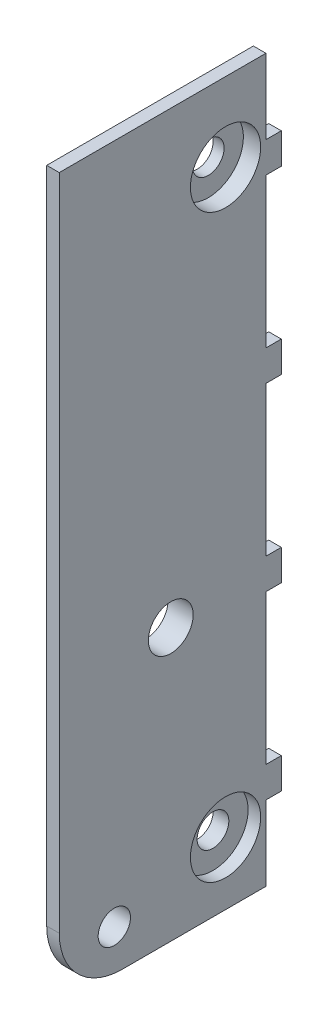
ISO-10303-21;
HEADER;
FILE_DESCRIPTION(('STEP AP214'),'2;1');
FILE_NAME('part.step','',(''),(''),'','','');
FILE_SCHEMA(('AUTOMOTIVE_DESIGN { 1 0 10303 214 1 1 1 1 }'));
ENDSEC;
DATA;
#1=APPLICATION_CONTEXT('core data for automotive mechanical design processes');
#2=APPLICATION_PROTOCOL_DEFINITION('international standard','automotive_design',2000,#1);
#3=PRODUCT_CONTEXT('',#1,'mechanical');
#4=PRODUCT('Part','Part','',(#3));
#5=PRODUCT_RELATED_PRODUCT_CATEGORY('part','',(#4));
#6=PRODUCT_DEFINITION_FORMATION('','',#4);
#7=PRODUCT_DEFINITION_CONTEXT('part definition',#1,'design');
#8=PRODUCT_DEFINITION('design','',#6,#7);
#9=PRODUCT_DEFINITION_SHAPE('','',#8);
#10=(LENGTH_UNIT() NAMED_UNIT(*) SI_UNIT(.MILLI.,.METRE.));
#11=(NAMED_UNIT(*) PLANE_ANGLE_UNIT() SI_UNIT($,.RADIAN.));
#12=(NAMED_UNIT(*) SI_UNIT($,.STERADIAN.) SOLID_ANGLE_UNIT());
#13=UNCERTAINTY_MEASURE_WITH_UNIT(LENGTH_MEASURE(1.E-05),#10,'distance_accuracy_value','');
#14=(GEOMETRIC_REPRESENTATION_CONTEXT(3) GLOBAL_UNCERTAINTY_ASSIGNED_CONTEXT((#13)) GLOBAL_UNIT_ASSIGNED_CONTEXT((#10,
#11,#12)) REPRESENTATION_CONTEXT('',''));
#15=CARTESIAN_POINT('',(0.,0.,0.));
#16=DIRECTION('',(0.,0.,1.));
#17=DIRECTION('',(1.,0.,0.));
#18=AXIS2_PLACEMENT_3D('',#15,#16,#17);
#19=CARTESIAN_POINT('',(-99.9999999999999,90.,17.));
#20=DIRECTION('',(1.,0.,0.));
#21=DIRECTION('',(0.,0.,-1.));
#22=AXIS2_PLACEMENT_3D('',#19,#20,#21);
#23=CYLINDRICAL_SURFACE('',#22,5.05);
#24=CARTESIAN_POINT('',(90.9999999999999,90.,17.));
#25=DIRECTION('',(-1.,0.,0.));
#26=DIRECTION('',(0.,0.,1.));
#27=AXIS2_PLACEMENT_3D('',#24,#25,#26);
#28=CIRCLE('',#27,5.05);
#29=CARTESIAN_POINT('',(90.9999999999999,90.,22.05));
#30=VERTEX_POINT('',#29);
#31=EDGE_CURVE('E608',#30,#30,#28,.T.);
#32=ORIENTED_EDGE('',*,*,#31,.T.);
#33=EDGE_LOOP('',(#32));
#34=FACE_BOUND('',#33,.T.);
#35=CARTESIAN_POINT('',(94.5000000000001,90.,17.));
#36=DIRECTION('',(1.,0.,0.));
#37=DIRECTION('',(0.,0.,-1.));
#38=AXIS2_PLACEMENT_3D('',#35,#36,#37);
#39=CIRCLE('',#38,5.05);
#40=CARTESIAN_POINT('',(94.5000000000001,90.,11.95));
#41=VERTEX_POINT('',#40);
#42=EDGE_CURVE('E43',#41,#41,#39,.F.);
#43=ORIENTED_EDGE('',*,*,#42,.F.);
#44=EDGE_LOOP('',(#43));
#45=FACE_BOUND('',#44,.T.);
#46=ADVANCED_FACE('F39',(#34,#45),#23,.F.);
#47=CARTESIAN_POINT('',(95.9999999999999,-111.,4.));
#48=DIRECTION('',(1.,0.,0.));
#49=DIRECTION('',(0.,0.,-1.));
#50=AXIS2_PLACEMENT_3D('',#47,#48,#49);
#51=PLANE('',#50);
#52=CARTESIAN_POINT('',(95.9999999999999,-95.,17.));
#53=DIRECTION('',(1.,0.,0.));
#54=DIRECTION('',(0.,0.,1.));
#55=AXIS2_PLACEMENT_3D('',#52,#53,#54);
#56=CIRCLE('',#55,12.5);
#57=CARTESIAN_POINT('',(95.9999999999999,-95.,29.5));
#58=VERTEX_POINT('',#57);
#59=EDGE_CURVE('E820',#58,#58,#56,.T.);
#60=ORIENTED_EDGE('',*,*,#59,.T.);
#61=EDGE_LOOP('',(#60));
#62=FACE_BOUND('',#61,.T.);
#63=CARTESIAN_POINT('',(95.9999999999999,-102.,52.45));
#64=DIRECTION('',(1.,0.,0.));
#65=DIRECTION('',(0.,0.,-1.));
#66=AXIS2_PLACEMENT_3D('',#63,#64,#65);
#67=CIRCLE('',#66,8.5);
#68=CARTESIAN_POINT('',(95.9999999999999,-102.,43.95));
#69=VERTEX_POINT('',#68);
#70=EDGE_CURVE('E49',#69,#69,#67,.F.);
#71=ORIENTED_EDGE('',*,*,#70,.F.);
#72=EDGE_LOOP('',(#71));
#73=FACE_BOUND('',#72,.T.);
#74=DIRECTION('',(0.,0.,-1.));
#75=VECTOR('',#74,1.);
#76=CARTESIAN_POINT('',(96.0000000000001,115.,70.));
#77=LINE('',#76,#75);
#78=CARTESIAN_POINT('',(96.0000000000001,115.,70.));
#79=VERTEX_POINT('',#78);
#80=CARTESIAN_POINT('',(95.9999999999999,115.,4.1191106251155));
#81=VERTEX_POINT('',#80);
#82=EDGE_CURVE('E346',#79,#81,#77,.T.);
#83=ORIENTED_EDGE('',*,*,#82,.T.);
#84=DIRECTION('',(0.,-1.,0.));
#85=VECTOR('',#84,1.);
#86=CARTESIAN_POINT('',(95.9999999999999,-111.,4.1191106251155));
#87=LINE('',#86,#85);
#88=CARTESIAN_POINT('',(95.9999999999999,91.15,4.1191106251155));
#89=VERTEX_POINT('',#88);
#90=EDGE_CURVE('E342',#81,#89,#87,.T.);
#91=ORIENTED_EDGE('',*,*,#90,.T.);
#92=DIRECTION('',(0.,0.,1.));
#93=VECTOR('',#92,1.);
#94=CARTESIAN_POINT('',(95.9999999999999,91.15,-0.780889374884504));
#95=LINE('',#94,#93);
#96=CARTESIAN_POINT('',(95.9999999999999,91.15,-0.780889374884504));
#97=VERTEX_POINT('',#96);
#98=EDGE_CURVE('E258',#97,#89,#95,.T.);
#99=ORIENTED_EDGE('',*,*,#98,.F.);
#100=DIRECTION('',(0.,-1.,0.));
#101=VECTOR('',#100,1.);
#102=CARTESIAN_POINT('',(95.9999999999999,91.15,-0.780889374884504));
#103=LINE('',#102,#101);
#104=CARTESIAN_POINT('',(95.9999999999999,81.35,-0.780889374884504));
#105=VERTEX_POINT('',#104);
#106=EDGE_CURVE('E242',#97,#105,#103,.T.);
#107=ORIENTED_EDGE('',*,*,#106,.T.);
#108=DIRECTION('',(0.,0.,1.));
#109=VECTOR('',#108,1.);
#110=CARTESIAN_POINT('',(95.9999999999999,81.35,-0.780889374884504));
#111=LINE('',#110,#109);
#112=CARTESIAN_POINT('',(95.9999999999999,81.35,4.1191106251155));
#113=VERTEX_POINT('',#112);
#114=EDGE_CURVE('E261',#105,#113,#111,.T.);
#115=ORIENTED_EDGE('',*,*,#114,.T.);
#116=CARTESIAN_POINT('',(95.9999999999999,33.65,4.1191106251155));
#117=VERTEX_POINT('',#116);
#118=EDGE_CURVE('E389',#113,#117,#87,.T.);
#119=ORIENTED_EDGE('',*,*,#118,.T.);
#120=DIRECTION('',(0.,0.,1.));
#121=VECTOR('',#120,1.);
#122=CARTESIAN_POINT('',(95.9999999999999,33.65,-0.780889374884504));
#123=LINE('',#122,#121);
#124=CARTESIAN_POINT('',(95.9999999999999,33.65,-0.780889374884504));
#125=VERTEX_POINT('',#124);
#126=EDGE_CURVE('E228',#125,#117,#123,.T.);
#127=ORIENTED_EDGE('',*,*,#126,.F.);
#128=DIRECTION('',(0.,-1.,0.));
#129=VECTOR('',#128,1.);
#130=CARTESIAN_POINT('',(95.9999999999999,23.85,-0.780889374884504));
#131=LINE('',#130,#129);
#132=CARTESIAN_POINT('',(95.9999999999999,23.85,-0.780889374884504));
#133=VERTEX_POINT('',#132);
#134=EDGE_CURVE('E211',#125,#133,#131,.T.);
#135=ORIENTED_EDGE('',*,*,#134,.T.);
#136=DIRECTION('',(0.,0.,1.));
#137=VECTOR('',#136,1.);
#138=CARTESIAN_POINT('',(95.9999999999999,23.85,-0.780889374884504));
#139=LINE('',#138,#137);
#140=CARTESIAN_POINT('',(95.9999999999999,23.85,4.1191106251155));
#141=VERTEX_POINT('',#140);
#142=EDGE_CURVE('E196',#133,#141,#139,.T.);
#143=ORIENTED_EDGE('',*,*,#142,.T.);
#144=CARTESIAN_POINT('',(95.9999999999999,-23.85,4.1191106251155));
#145=VERTEX_POINT('',#144);
#146=EDGE_CURVE('E390',#141,#145,#87,.T.);
#147=ORIENTED_EDGE('',*,*,#146,.T.);
#148=DIRECTION('',(0.,0.,1.));
#149=VECTOR('',#148,1.);
#150=CARTESIAN_POINT('',(95.9999999999999,-23.85,-0.780889374884504));
#151=LINE('',#150,#149);
#152=CARTESIAN_POINT('',(95.9999999999999,-23.85,-0.780889374884504));
#153=VERTEX_POINT('',#152);
#154=EDGE_CURVE('E290',#153,#145,#151,.T.);
#155=ORIENTED_EDGE('',*,*,#154,.F.);
#156=DIRECTION('',(0.,1.,0.));
#157=VECTOR('',#156,1.);
#158=CARTESIAN_POINT('',(95.9999999999999,-23.85,-0.780889374884504));
#159=LINE('',#158,#157);
#160=CARTESIAN_POINT('',(95.9999999999999,-33.65,-0.780889374884504));
#161=VERTEX_POINT('',#160);
#162=EDGE_CURVE('E276',#161,#153,#159,.T.);
#163=ORIENTED_EDGE('',*,*,#162,.F.);
#164=DIRECTION('',(0.,0.,1.));
#165=VECTOR('',#164,1.);
#166=CARTESIAN_POINT('',(95.9999999999999,-33.65,-0.780889374884504));
#167=LINE('',#166,#165);
#168=CARTESIAN_POINT('',(95.9999999999999,-33.65,4.1191106251155));
#169=VERTEX_POINT('',#168);
#170=EDGE_CURVE('E294',#161,#169,#167,.T.);
#171=ORIENTED_EDGE('',*,*,#170,.T.);
#172=CARTESIAN_POINT('',(95.9999999999999,-81.35,4.1191106251155));
#173=VERTEX_POINT('',#172);
#174=EDGE_CURVE('E499',#169,#173,#87,.T.);
#175=ORIENTED_EDGE('',*,*,#174,.T.);
#176=DIRECTION('',(0.,0.,1.));
#177=VECTOR('',#176,1.);
#178=CARTESIAN_POINT('',(95.9999999999999,-81.35,-0.780889374884504));
#179=LINE('',#178,#177);
#180=CARTESIAN_POINT('',(95.9999999999999,-81.35,-0.780889374884504));
#181=VERTEX_POINT('',#180);
#182=EDGE_CURVE('E325',#181,#173,#179,.T.);
#183=ORIENTED_EDGE('',*,*,#182,.F.);
#184=DIRECTION('',(0.,1.,0.));
#185=VECTOR('',#184,1.);
#186=CARTESIAN_POINT('',(95.9999999999999,-91.15,-0.780889374884504));
#187=LINE('',#186,#185);
#188=CARTESIAN_POINT('',(95.9999999999999,-91.15,-0.780889374884504));
#189=VERTEX_POINT('',#188);
#190=EDGE_CURVE('E309',#189,#181,#187,.T.);
#191=ORIENTED_EDGE('',*,*,#190,.F.);
#192=DIRECTION('',(0.,0.,1.));
#193=VECTOR('',#192,1.);
#194=CARTESIAN_POINT('',(95.9999999999999,-91.15,-0.780889374884504));
#195=LINE('',#194,#193);
#196=CARTESIAN_POINT('',(95.9999999999999,-91.15,4.1191106251155));
#197=VERTEX_POINT('',#196);
#198=EDGE_CURVE('E329',#189,#197,#195,.T.);
#199=ORIENTED_EDGE('',*,*,#198,.T.);
#200=CARTESIAN_POINT('',(96.0000000000001,-115.,4.1191106251155));
#201=VERTEX_POINT('',#200);
#202=EDGE_CURVE('E374',#197,#201,#87,.T.);
#203=ORIENTED_EDGE('',*,*,#202,.T.);
#204=DIRECTION('',(0.,0.,-1.));
#205=VECTOR('',#204,1.);
#206=CARTESIAN_POINT('',(96.0000000000001,-115.,70.));
#207=LINE('',#206,#205);
#208=CARTESIAN_POINT('',(96.0000000000001,-115.,50.));
#209=VERTEX_POINT('',#208);
#210=EDGE_CURVE('E351',#209,#201,#207,.T.);
#211=ORIENTED_EDGE('',*,*,#210,.F.);
#212=CARTESIAN_POINT('',(95.9999999999999,-95.,50.));
#213=DIRECTION('',(1.,0.,0.));
#214=DIRECTION('',(0.,0.,-1.));
#215=AXIS2_PLACEMENT_3D('',#212,#213,#214);
#216=CIRCLE('',#215,20.);
#217=CARTESIAN_POINT('',(95.9999999999999,-95.,70.));
#218=VERTEX_POINT('',#217);
#219=EDGE_CURVE('E338',#209,#218,#216,.F.);
#220=ORIENTED_EDGE('',*,*,#219,.T.);
#221=DIRECTION('',(0.,1.,0.));
#222=VECTOR('',#221,1.);
#223=CARTESIAN_POINT('',(95.9999999999999,-111.,70.));
#224=LINE('',#223,#222);
#225=EDGE_CURVE('E341',#218,#79,#224,.T.);
#226=ORIENTED_EDGE('',*,*,#225,.T.);
#227=EDGE_LOOP('',(#83,#91,#99,#107,#115,#119,#127,#135,#143,#147,#155,#163,#171,#175,#183,#191,
#199,#203,#211,#220,#226));
#228=FACE_BOUND('',#227,.T.);
#229=CARTESIAN_POINT('',(95.9999999999999,90.,17.));
#230=DIRECTION('',(1.,0.,0.));
#231=DIRECTION('',(0.,0.,-1.));
#232=AXIS2_PLACEMENT_3D('',#229,#230,#231);
#233=CIRCLE('',#232,12.5);
#234=CARTESIAN_POINT('',(95.9999999999999,90.,4.5));
#235=VERTEX_POINT('',#234);
#236=EDGE_CURVE('E405',#235,#235,#233,.F.);
#237=ORIENTED_EDGE('',*,*,#236,.F.);
#238=EDGE_LOOP('',(#237));
#239=FACE_BOUND('',#238,.T.);
#240=CARTESIAN_POINT('',(95.9999999999999,-28.4,34.45));
#241=DIRECTION('',(1.,0.,0.));
#242=DIRECTION('',(0.,0.,-1.));
#243=AXIS2_PLACEMENT_3D('',#240,#241,#242);
#244=CIRCLE('',#243,10.);
#245=CARTESIAN_POINT('',(95.9999999999999,-28.4,24.45));
#246=VERTEX_POINT('',#245);
#247=EDGE_CURVE('E11',#246,#246,#244,.F.);
#248=ORIENTED_EDGE('',*,*,#247,.F.);
#249=EDGE_LOOP('',(#248));
#250=FACE_BOUND('',#249,.T.);
#251=ADVANCED_FACE('F415',(#62,#73,#228,#239,#250),#51,.F.);
#252=CARTESIAN_POINT('',(100.,-115.,4.1191106251155));
#253=DIRECTION('',(0.,0.,1.));
#254=DIRECTION('',(1.,0.,0.));
#255=AXIS2_PLACEMENT_3D('',#252,#253,#254);
#256=PLANE('',#255);
#257=ORIENTED_EDGE('',*,*,#146,.F.);
#258=DIRECTION('',(1.,0.,0.));
#259=VECTOR('',#258,1.);
#260=CARTESIAN_POINT('',(100.,23.85,4.1191106251155));
#261=LINE('',#260,#259);
#262=CARTESIAN_POINT('',(100.,23.85,4.1191106251155));
#263=VERTEX_POINT('',#262);
#264=EDGE_CURVE('E56',#141,#263,#261,.T.);
#265=ORIENTED_EDGE('',*,*,#264,.T.);
#266=DIRECTION('',(0.,1.,0.));
#267=VECTOR('',#266,1.);
#268=CARTESIAN_POINT('',(100.,-115.,4.1191106251155));
#269=LINE('',#268,#267);
#270=CARTESIAN_POINT('',(100.,-23.85,4.1191106251155));
#271=VERTEX_POINT('',#270);
#272=EDGE_CURVE('E193',#271,#263,#269,.T.);
#273=ORIENTED_EDGE('',*,*,#272,.F.);
#274=DIRECTION('',(1.,0.,0.));
#275=VECTOR('',#274,1.);
#276=CARTESIAN_POINT('',(100.,-23.85,4.1191106251155));
#277=LINE('',#276,#275);
#278=EDGE_CURVE('E273',#145,#271,#277,.T.);
#279=ORIENTED_EDGE('',*,*,#278,.F.);
#280=EDGE_LOOP('',(#257,#265,#273,#279));
#281=FACE_BOUND('',#280,.T.);
#282=ADVANCED_FACE('F418',(#281),#256,.F.);
#283=CARTESIAN_POINT('',(100.,33.65,4.1191106251155));
#284=VERTEX_POINT('',#283);
#285=CARTESIAN_POINT('',(100.,81.35,4.1191106251155));
#286=VERTEX_POINT('',#285);
#287=EDGE_CURVE('E395',#284,#286,#269,.T.);
#288=ORIENTED_EDGE('',*,*,#287,.F.);
#289=DIRECTION('',(-1.,0.,0.));
#290=VECTOR('',#289,1.);
#291=CARTESIAN_POINT('',(100.,33.65,4.1191106251155));
#292=LINE('',#291,#290);
#293=EDGE_CURVE('E207',#284,#117,#292,.T.);
#294=ORIENTED_EDGE('',*,*,#293,.T.);
#295=ORIENTED_EDGE('',*,*,#118,.F.);
#296=DIRECTION('',(1.,0.,0.));
#297=VECTOR('',#296,1.);
#298=CARTESIAN_POINT('',(100.,81.35,4.1191106251155));
#299=LINE('',#298,#297);
#300=EDGE_CURVE('E64',#113,#286,#299,.T.);
#301=ORIENTED_EDGE('',*,*,#300,.T.);
#302=EDGE_LOOP('',(#288,#294,#295,#301));
#303=FACE_BOUND('',#302,.T.);
#304=ADVANCED_FACE('F496',(#303),#256,.F.);
#305=DIRECTION('',(-1.,0.,0.));
#306=VECTOR('',#305,1.);
#307=CARTESIAN_POINT('',(100.,-33.65,4.1191106251155));
#308=LINE('',#307,#306);
#309=CARTESIAN_POINT('',(100.,-33.65,4.1191106251155));
#310=VERTEX_POINT('',#309);
#311=EDGE_CURVE('E267',#310,#169,#308,.T.);
#312=ORIENTED_EDGE('',*,*,#311,.F.);
#313=CARTESIAN_POINT('',(100.,-81.35,4.1191106251155));
#314=VERTEX_POINT('',#313);
#315=EDGE_CURVE('E394',#314,#310,#269,.T.);
#316=ORIENTED_EDGE('',*,*,#315,.F.);
#317=DIRECTION('',(1.,0.,0.));
#318=VECTOR('',#317,1.);
#319=CARTESIAN_POINT('',(100.,-81.35,4.1191106251155));
#320=LINE('',#319,#318);
#321=EDGE_CURVE('E306',#173,#314,#320,.T.);
#322=ORIENTED_EDGE('',*,*,#321,.F.);
#323=ORIENTED_EDGE('',*,*,#174,.F.);
#324=EDGE_LOOP('',(#312,#316,#322,#323));
#325=FACE_BOUND('',#324,.T.);
#326=ADVANCED_FACE('F41',(#325),#256,.F.);
#327=CARTESIAN_POINT('',(100.,91.15,4.1191106251155));
#328=VERTEX_POINT('',#327);
#329=CARTESIAN_POINT('',(100.,115.,4.1191106251155));
#330=VERTEX_POINT('',#329);
#331=EDGE_CURVE('E364',#328,#330,#269,.T.);
#332=ORIENTED_EDGE('',*,*,#331,.F.);
#333=DIRECTION('',(-1.,0.,0.));
#334=VECTOR('',#333,1.);
#335=CARTESIAN_POINT('',(100.,91.15,4.1191106251155));
#336=LINE('',#335,#334);
#337=EDGE_CURVE('E238',#328,#89,#336,.T.);
#338=ORIENTED_EDGE('',*,*,#337,.T.);
#339=ORIENTED_EDGE('',*,*,#90,.F.);
#340=DIRECTION('',(1.,0.,0.));
#341=VECTOR('',#340,1.);
#342=CARTESIAN_POINT('',(100.,115.,4.1191106251155));
#343=LINE('',#342,#341);
#344=EDGE_CURVE('E385',#81,#330,#343,.T.);
#345=ORIENTED_EDGE('',*,*,#344,.T.);
#346=EDGE_LOOP('',(#332,#338,#339,#345));
#347=FACE_BOUND('',#346,.T.);
#348=ADVANCED_FACE('F473',(#347),#256,.F.);
#349=DIRECTION('',(-1.,0.,0.));
#350=VECTOR('',#349,1.);
#351=CARTESIAN_POINT('',(100.,-91.15,4.1191106251155));
#352=LINE('',#351,#350);
#353=CARTESIAN_POINT('',(100.,-91.15,4.1191106251155));
#354=VERTEX_POINT('',#353);
#355=EDGE_CURVE('E300',#354,#197,#352,.T.);
#356=ORIENTED_EDGE('',*,*,#355,.F.);
#357=CARTESIAN_POINT('',(100.,-115.,4.1191106251155));
#358=VERTEX_POINT('',#357);
#359=EDGE_CURVE('E352',#358,#354,#269,.T.);
#360=ORIENTED_EDGE('',*,*,#359,.F.);
#361=DIRECTION('',(1.,0.,0.));
#362=VECTOR('',#361,1.);
#363=CARTESIAN_POINT('',(100.,-115.,4.1191106251155));
#364=LINE('',#363,#362);
#365=EDGE_CURVE('E347',#201,#358,#364,.T.);
#366=ORIENTED_EDGE('',*,*,#365,.F.);
#367=ORIENTED_EDGE('',*,*,#202,.F.);
#368=EDGE_LOOP('',(#356,#360,#366,#367));
#369=FACE_BOUND('',#368,.T.);
#370=ADVANCED_FACE('F466',(#369),#256,.F.);
#371=CARTESIAN_POINT('',(-99.9999999999999,115.,70.));
#372=DIRECTION('',(0.,-1.,0.));
#373=DIRECTION('',(0.,0.,-1.));
#374=AXIS2_PLACEMENT_3D('',#371,#372,#373);
#375=PLANE('',#374);
#376=DIRECTION('',(0.,0.,-1.));
#377=VECTOR('',#376,1.);
#378=CARTESIAN_POINT('',(100.,115.,70.));
#379=LINE('',#378,#377);
#380=CARTESIAN_POINT('',(100.,115.,70.));
#381=VERTEX_POINT('',#380);
#382=EDGE_CURVE('E337',#381,#330,#379,.T.);
#383=ORIENTED_EDGE('',*,*,#382,.T.);
#384=ORIENTED_EDGE('',*,*,#344,.F.);
#385=ORIENTED_EDGE('',*,*,#82,.F.);
#386=DIRECTION('',(-1.,0.,0.));
#387=VECTOR('',#386,1.);
#388=CARTESIAN_POINT('',(-99.9999999999999,115.,70.));
#389=LINE('',#388,#387);
#390=EDGE_CURVE('E365',#381,#79,#389,.T.);
#391=ORIENTED_EDGE('',*,*,#390,.F.);
#392=EDGE_LOOP('',(#383,#384,#385,#391));
#393=FACE_BOUND('',#392,.T.);
#394=ADVANCED_FACE('F463',(#393),#375,.F.);
#395=CARTESIAN_POINT('',(0.,0.,70.));
#396=DIRECTION('',(0.,0.,-1.));
#397=DIRECTION('',(-1.,0.,0.));
#398=AXIS2_PLACEMENT_3D('',#395,#396,#397);
#399=PLANE('',#398);
#400=ORIENTED_EDGE('',*,*,#225,.F.);
#401=DIRECTION('',(1.,0.,0.));
#402=VECTOR('',#401,1.);
#403=CARTESIAN_POINT('',(0.,-95.,70.));
#404=LINE('',#403,#402);
#405=CARTESIAN_POINT('',(100.,-95.,70.));
#406=VERTEX_POINT('',#405);
#407=EDGE_CURVE('E353',#218,#406,#404,.T.);
#408=ORIENTED_EDGE('',*,*,#407,.T.);
#409=DIRECTION('',(0.,1.,0.));
#410=VECTOR('',#409,1.);
#411=CARTESIAN_POINT('',(100.,-115.,70.));
#412=LINE('',#411,#410);
#413=EDGE_CURVE('E357',#406,#381,#412,.T.);
#414=ORIENTED_EDGE('',*,*,#413,.T.);
#415=ORIENTED_EDGE('',*,*,#390,.T.);
#416=EDGE_LOOP('',(#400,#408,#414,#415));
#417=FACE_BOUND('',#416,.T.);
#418=ADVANCED_FACE('F465',(#417),#399,.F.);
#419=CARTESIAN_POINT('',(100.,-115.,70.));
#420=DIRECTION('',(-1.,0.,0.));
#421=DIRECTION('',(0.,0.,1.));
#422=AXIS2_PLACEMENT_3D('',#419,#420,#421);
#423=PLANE('',#422);
#424=CARTESIAN_POINT('',(100.,90.,17.));
#425=DIRECTION('',(-1.,0.,0.));
#426=DIRECTION('',(0.,0.,-1.));
#427=AXIS2_PLACEMENT_3D('',#424,#425,#426);
#428=CIRCLE('',#427,11.2);
#429=CARTESIAN_POINT('',(100.,90.,5.8));
#430=VERTEX_POINT('',#429);
#431=EDGE_CURVE('E573',#430,#430,#428,.T.);
#432=ORIENTED_EDGE('',*,*,#431,.T.);
#433=EDGE_LOOP('',(#432));
#434=FACE_BOUND('',#433,.T.);
#435=CARTESIAN_POINT('',(100.,-95.,17.));
#436=DIRECTION('',(1.,0.,0.));
#437=DIRECTION('',(0.,0.,-1.));
#438=AXIS2_PLACEMENT_3D('',#435,#436,#437);
#439=CIRCLE('',#438,11.2);
#440=CARTESIAN_POINT('',(100.,-95.,5.8));
#441=VERTEX_POINT('',#440);
#442=EDGE_CURVE('E577',#441,#441,#439,.T.);
#443=ORIENTED_EDGE('',*,*,#442,.F.);
#444=EDGE_LOOP('',(#443));
#445=FACE_BOUND('',#444,.T.);
#446=CARTESIAN_POINT('',(100.,-102.,52.45));
#447=DIRECTION('',(1.,0.,0.));
#448=DIRECTION('',(0.,0.,-1.));
#449=AXIS2_PLACEMENT_3D('',#446,#447,#448);
#450=CIRCLE('',#449,5.15);
#451=CARTESIAN_POINT('',(100.,-102.,47.3));
#452=VERTEX_POINT('',#451);
#453=EDGE_CURVE('E381',#452,#452,#450,.T.);
#454=ORIENTED_EDGE('',*,*,#453,.F.);
#455=EDGE_LOOP('',(#454));
#456=FACE_BOUND('',#455,.T.);
#457=CARTESIAN_POINT('',(100.,-28.4,34.45));
#458=DIRECTION('',(1.,0.,0.));
#459=DIRECTION('',(0.,0.,-1.));
#460=AXIS2_PLACEMENT_3D('',#457,#458,#459);
#461=CIRCLE('',#460,7.15);
#462=CARTESIAN_POINT('',(100.,-28.4,27.3));
#463=VERTEX_POINT('',#462);
#464=EDGE_CURVE('E370',#463,#463,#461,.T.);
#465=ORIENTED_EDGE('',*,*,#464,.F.);
#466=EDGE_LOOP('',(#465));
#467=FACE_BOUND('',#466,.T.);
#468=DIRECTION('',(0.,0.,-1.));
#469=VECTOR('',#468,1.);
#470=CARTESIAN_POINT('',(100.,-115.,70.));
#471=LINE('',#470,#469);
#472=CARTESIAN_POINT('',(100.,-115.,50.));
#473=VERTEX_POINT('',#472);
#474=EDGE_CURVE('E361',#473,#358,#471,.T.);
#475=ORIENTED_EDGE('',*,*,#474,.T.);
#476=ORIENTED_EDGE('',*,*,#359,.T.);
#477=DIRECTION('',(0.,0.,1.));
#478=VECTOR('',#477,1.);
#479=CARTESIAN_POINT('',(100.,-91.15,-0.780889374884504));
#480=LINE('',#479,#478);
#481=CARTESIAN_POINT('',(100.,-91.15,-0.780889374884504));
#482=VERTEX_POINT('',#481);
#483=EDGE_CURVE('E333',#482,#354,#480,.T.);
#484=ORIENTED_EDGE('',*,*,#483,.F.);
#485=DIRECTION('',(0.,-1.,0.));
#486=VECTOR('',#485,1.);
#487=CARTESIAN_POINT('',(100.,-91.15,-0.780889374884504));
#488=LINE('',#487,#486);
#489=CARTESIAN_POINT('',(100.,-81.35,-0.780889374884504));
#490=VERTEX_POINT('',#489);
#491=EDGE_CURVE('E301',#490,#482,#488,.T.);
#492=ORIENTED_EDGE('',*,*,#491,.F.);
#493=DIRECTION('',(0.,0.,1.));
#494=VECTOR('',#493,1.);
#495=CARTESIAN_POINT('',(100.,-81.35,-0.780889374884504));
#496=LINE('',#495,#494);
#497=EDGE_CURVE('E315',#490,#314,#496,.T.);
#498=ORIENTED_EDGE('',*,*,#497,.T.);
#499=ORIENTED_EDGE('',*,*,#315,.T.);
#500=DIRECTION('',(0.,0.,1.));
#501=VECTOR('',#500,1.);
#502=CARTESIAN_POINT('',(100.,-33.65,-0.780889374884504));
#503=LINE('',#502,#501);
#504=CARTESIAN_POINT('',(100.,-33.65,-0.780889374884504));
#505=VERTEX_POINT('',#504);
#506=EDGE_CURVE('E297',#505,#310,#503,.T.);
#507=ORIENTED_EDGE('',*,*,#506,.F.);
#508=DIRECTION('',(0.,-1.,0.));
#509=VECTOR('',#508,1.);
#510=CARTESIAN_POINT('',(100.,-23.85,-0.780889374884504));
#511=LINE('',#510,#509);
#512=CARTESIAN_POINT('',(100.,-23.85,-0.780889374884504));
#513=VERTEX_POINT('',#512);
#514=EDGE_CURVE('E268',#513,#505,#511,.T.);
#515=ORIENTED_EDGE('',*,*,#514,.F.);
#516=DIRECTION('',(0.,0.,1.));
#517=VECTOR('',#516,1.);
#518=CARTESIAN_POINT('',(100.,-23.85,-0.780889374884504));
#519=LINE('',#518,#517);
#520=EDGE_CURVE('E282',#513,#271,#519,.T.);
#521=ORIENTED_EDGE('',*,*,#520,.T.);
#522=ORIENTED_EDGE('',*,*,#272,.T.);
#523=DIRECTION('',(0.,0.,1.));
#524=VECTOR('',#523,1.);
#525=CARTESIAN_POINT('',(100.,23.85,-0.780889374884504));
#526=LINE('',#525,#524);
#527=CARTESIAN_POINT('',(100.,23.85,-0.780889374884504));
#528=VERTEX_POINT('',#527);
#529=EDGE_CURVE('E185',#528,#263,#526,.T.);
#530=ORIENTED_EDGE('',*,*,#529,.F.);
#531=DIRECTION('',(0.,1.,0.));
#532=VECTOR('',#531,1.);
#533=CARTESIAN_POINT('',(100.,23.85,-0.780889374884504));
#534=LINE('',#533,#532);
#535=CARTESIAN_POINT('',(100.,33.65,-0.780889374884504));
#536=VERTEX_POINT('',#535);
#537=EDGE_CURVE('E189',#528,#536,#534,.T.);
#538=ORIENTED_EDGE('',*,*,#537,.T.);
#539=DIRECTION('',(0.,0.,1.));
#540=VECTOR('',#539,1.);
#541=CARTESIAN_POINT('',(100.,33.65,-0.780889374884504));
#542=LINE('',#541,#540);
#543=EDGE_CURVE('E219',#536,#284,#542,.T.);
#544=ORIENTED_EDGE('',*,*,#543,.T.);
#545=ORIENTED_EDGE('',*,*,#287,.T.);
#546=DIRECTION('',(0.,0.,1.));
#547=VECTOR('',#546,1.);
#548=CARTESIAN_POINT('',(100.,81.35,-0.780889374884504));
#549=LINE('',#548,#547);
#550=CARTESIAN_POINT('',(100.,81.35,-0.780889374884504));
#551=VERTEX_POINT('',#550);
#552=EDGE_CURVE('E264',#551,#286,#549,.T.);
#553=ORIENTED_EDGE('',*,*,#552,.F.);
#554=DIRECTION('',(0.,1.,0.));
#555=VECTOR('',#554,1.);
#556=CARTESIAN_POINT('',(100.,91.15,-0.780889374884504));
#557=LINE('',#556,#555);
#558=CARTESIAN_POINT('',(100.,91.15,-0.780889374884504));
#559=VERTEX_POINT('',#558);
#560=EDGE_CURVE('E233',#551,#559,#557,.T.);
#561=ORIENTED_EDGE('',*,*,#560,.T.);
#562=DIRECTION('',(0.,0.,1.));
#563=VECTOR('',#562,1.);
#564=CARTESIAN_POINT('',(100.,91.15,-0.780889374884504));
#565=LINE('',#564,#563);
#566=EDGE_CURVE('E250',#559,#328,#565,.T.);
#567=ORIENTED_EDGE('',*,*,#566,.T.);
#568=ORIENTED_EDGE('',*,*,#331,.T.);
#569=ORIENTED_EDGE('',*,*,#382,.F.);
#570=ORIENTED_EDGE('',*,*,#413,.F.);
#571=CARTESIAN_POINT('',(100.,-95.,50.));
#572=DIRECTION('',(-1.,0.,0.));
#573=DIRECTION('',(0.,0.,1.));
#574=AXIS2_PLACEMENT_3D('',#571,#572,#573);
#575=CIRCLE('',#574,20.);
#576=EDGE_CURVE('E348',#406,#473,#575,.F.);
#577=ORIENTED_EDGE('',*,*,#576,.T.);
#578=EDGE_LOOP('',(#475,#476,#484,#492,#498,#499,#507,#515,#521,#522,#530,#538,#544,#545,#553,
#561,#567,#568,#569,#570,#577));
#579=FACE_BOUND('',#578,.T.);
#580=ADVANCED_FACE('F188',(#434,#445,#456,#467,#579),#423,.F.);
#581=CARTESIAN_POINT('',(-99.9999999999999,-115.,70.));
#582=DIRECTION('',(0.,1.,0.));
#583=DIRECTION('',(0.,0.,1.));
#584=AXIS2_PLACEMENT_3D('',#581,#582,#583);
#585=PLANE('',#584);
#586=ORIENTED_EDGE('',*,*,#210,.T.);
#587=ORIENTED_EDGE('',*,*,#365,.T.);
#588=ORIENTED_EDGE('',*,*,#474,.F.);
#589=DIRECTION('',(1.,0.,0.));
#590=VECTOR('',#589,1.);
#591=CARTESIAN_POINT('',(-99.9999999999999,-115.,50.));
#592=LINE('',#591,#590);
#593=EDGE_CURVE('E343',#473,#209,#592,.F.);
#594=ORIENTED_EDGE('',*,*,#593,.T.);
#595=EDGE_LOOP('',(#586,#587,#588,#594));
#596=FACE_BOUND('',#595,.T.);
#597=ADVANCED_FACE('F460',(#596),#585,.F.);
#598=CARTESIAN_POINT('',(-99.9999999999999,-28.4,34.45));
#599=DIRECTION('',(1.,0.,0.));
#600=DIRECTION('',(0.,0.,-1.));
#601=AXIS2_PLACEMENT_3D('',#598,#599,#600);
#602=CYLINDRICAL_SURFACE('',#601,7.15);
#603=ORIENTED_EDGE('',*,*,#464,.T.);
#604=EDGE_LOOP('',(#603));
#605=FACE_BOUND('',#604,.T.);
#606=CARTESIAN_POINT('',(91.9999999999999,-28.4,34.45));
#607=DIRECTION('',(-1.,0.,0.));
#608=DIRECTION('',(0.,0.,1.));
#609=AXIS2_PLACEMENT_3D('',#606,#607,#608);
#610=CIRCLE('',#609,7.15000000000001);
#611=CARTESIAN_POINT('',(91.9999999999999,-28.4,41.6));
#612=VERTEX_POINT('',#611);
#613=EDGE_CURVE('E586',#612,#612,#610,.T.);
#614=ORIENTED_EDGE('',*,*,#613,.T.);
#615=EDGE_LOOP('',(#614));
#616=FACE_BOUND('',#615,.T.);
#617=ADVANCED_FACE('F453',(#605,#616),#602,.F.);
#618=CARTESIAN_POINT('',(-99.9999999999999,-102.,52.45));
#619=DIRECTION('',(1.,0.,0.));
#620=DIRECTION('',(0.,0.,-1.));
#621=AXIS2_PLACEMENT_3D('',#618,#619,#620);
#622=CYLINDRICAL_SURFACE('',#621,5.15);
#623=ORIENTED_EDGE('',*,*,#453,.T.);
#624=EDGE_LOOP('',(#623));
#625=FACE_BOUND('',#624,.T.);
#626=CARTESIAN_POINT('',(90.9999999999999,-102.,52.45));
#627=DIRECTION('',(-1.,0.,0.));
#628=DIRECTION('',(0.,0.,1.));
#629=AXIS2_PLACEMENT_3D('',#626,#627,#628);
#630=CIRCLE('',#629,5.15);
#631=CARTESIAN_POINT('',(90.9999999999999,-102.,57.6));
#632=VERTEX_POINT('',#631);
#633=EDGE_CURVE('E595',#632,#632,#630,.T.);
#634=ORIENTED_EDGE('',*,*,#633,.T.);
#635=EDGE_LOOP('',(#634));
#636=FACE_BOUND('',#635,.T.);
#637=ADVANCED_FACE('F455',(#625,#636),#622,.F.);
#638=CARTESIAN_POINT('',(0.,-95.,50.));
#639=DIRECTION('',(1.,0.,0.));
#640=DIRECTION('',(0.,0.,-1.));
#641=AXIS2_PLACEMENT_3D('',#638,#639,#640);
#642=CYLINDRICAL_SURFACE('',#641,20.);
#643=ORIENTED_EDGE('',*,*,#219,.F.);
#644=ORIENTED_EDGE('',*,*,#593,.F.);
#645=ORIENTED_EDGE('',*,*,#576,.F.);
#646=ORIENTED_EDGE('',*,*,#407,.F.);
#647=EDGE_LOOP('',(#643,#644,#645,#646));
#648=FACE_BOUND('',#647,.T.);
#649=ADVANCED_FACE('F458',(#648),#642,.T.);
#650=CARTESIAN_POINT('',(100.,-91.15,-0.780889374884504));
#651=DIRECTION('',(0.,1.,0.));
#652=DIRECTION('',(0.,0.,1.));
#653=AXIS2_PLACEMENT_3D('',#650,#651,#652);
#654=PLANE('',#653);
#655=ORIENTED_EDGE('',*,*,#355,.T.);
#656=ORIENTED_EDGE('',*,*,#198,.F.);
#657=DIRECTION('',(-1.,0.,0.));
#658=VECTOR('',#657,1.);
#659=CARTESIAN_POINT('',(100.,-91.15,-0.780889374884504));
#660=LINE('',#659,#658);
#661=EDGE_CURVE('E305',#482,#189,#660,.T.);
#662=ORIENTED_EDGE('',*,*,#661,.F.);
#663=ORIENTED_EDGE('',*,*,#483,.T.);
#664=EDGE_LOOP('',(#655,#656,#662,#663));
#665=FACE_BOUND('',#664,.T.);
#666=ADVANCED_FACE('F519',(#665),#654,.F.);
#667=CARTESIAN_POINT('',(100.,-81.35,-0.780889374884504));
#668=DIRECTION('',(0.,-1.,0.));
#669=DIRECTION('',(0.,0.,-1.));
#670=AXIS2_PLACEMENT_3D('',#667,#668,#669);
#671=PLANE('',#670);
#672=ORIENTED_EDGE('',*,*,#321,.T.);
#673=ORIENTED_EDGE('',*,*,#497,.F.);
#674=DIRECTION('',(1.,0.,0.));
#675=VECTOR('',#674,1.);
#676=CARTESIAN_POINT('',(100.,-81.35,-0.780889374884504));
#677=LINE('',#676,#675);
#678=EDGE_CURVE('E312',#181,#490,#677,.T.);
#679=ORIENTED_EDGE('',*,*,#678,.F.);
#680=ORIENTED_EDGE('',*,*,#182,.T.);
#681=EDGE_LOOP('',(#672,#673,#679,#680));
#682=FACE_BOUND('',#681,.T.);
#683=ADVANCED_FACE('F527',(#682),#671,.F.);
#684=CARTESIAN_POINT('',(0.,0.,-0.780889374884504));
#685=DIRECTION('',(0.,0.,1.));
#686=DIRECTION('',(1.,0.,0.));
#687=AXIS2_PLACEMENT_3D('',#684,#685,#686);
#688=PLANE('',#687);
#689=ORIENTED_EDGE('',*,*,#491,.T.);
#690=ORIENTED_EDGE('',*,*,#661,.T.);
#691=ORIENTED_EDGE('',*,*,#190,.T.);
#692=ORIENTED_EDGE('',*,*,#678,.T.);
#693=EDGE_LOOP('',(#689,#690,#691,#692));
#694=FACE_BOUND('',#693,.T.);
#695=ADVANCED_FACE('F521',(#694),#688,.F.);
#696=CARTESIAN_POINT('',(100.,-33.65,-0.780889374884504));
#697=DIRECTION('',(0.,1.,0.));
#698=DIRECTION('',(-1.,0.,0.));
#699=AXIS2_PLACEMENT_3D('',#696,#697,#698);
#700=PLANE('',#699);
#701=ORIENTED_EDGE('',*,*,#311,.T.);
#702=ORIENTED_EDGE('',*,*,#170,.F.);
#703=DIRECTION('',(-1.,0.,0.));
#704=VECTOR('',#703,1.);
#705=CARTESIAN_POINT('',(100.,-33.65,-0.780889374884504));
#706=LINE('',#705,#704);
#707=EDGE_CURVE('E272',#505,#161,#706,.T.);
#708=ORIENTED_EDGE('',*,*,#707,.F.);
#709=ORIENTED_EDGE('',*,*,#506,.T.);
#710=EDGE_LOOP('',(#701,#702,#708,#709));
#711=FACE_BOUND('',#710,.T.);
#712=ADVANCED_FACE('F549',(#711),#700,.F.);
#713=CARTESIAN_POINT('',(100.,-23.85,-0.780889374884504));
#714=DIRECTION('',(0.,-1.,0.));
#715=DIRECTION('',(1.,0.,0.));
#716=AXIS2_PLACEMENT_3D('',#713,#714,#715);
#717=PLANE('',#716);
#718=ORIENTED_EDGE('',*,*,#278,.T.);
#719=ORIENTED_EDGE('',*,*,#520,.F.);
#720=DIRECTION('',(1.,0.,0.));
#721=VECTOR('',#720,1.);
#722=CARTESIAN_POINT('',(100.,-23.85,-0.780889374884504));
#723=LINE('',#722,#721);
#724=EDGE_CURVE('E279',#153,#513,#723,.T.);
#725=ORIENTED_EDGE('',*,*,#724,.F.);
#726=ORIENTED_EDGE('',*,*,#154,.T.);
#727=EDGE_LOOP('',(#718,#719,#725,#726));
#728=FACE_BOUND('',#727,.T.);
#729=ADVANCED_FACE('F541',(#728),#717,.F.);
#730=CARTESIAN_POINT('',(0.,0.,-0.780889374884504));
#731=DIRECTION('',(0.,0.,-1.));
#732=DIRECTION('',(-1.,0.,0.));
#733=AXIS2_PLACEMENT_3D('',#730,#731,#732);
#734=PLANE('',#733);
#735=ORIENTED_EDGE('',*,*,#514,.T.);
#736=ORIENTED_EDGE('',*,*,#707,.T.);
#737=ORIENTED_EDGE('',*,*,#162,.T.);
#738=ORIENTED_EDGE('',*,*,#724,.T.);
#739=EDGE_LOOP('',(#735,#736,#737,#738));
#740=FACE_BOUND('',#739,.T.);
#741=ADVANCED_FACE('F545',(#740),#734,.T.);
#742=CARTESIAN_POINT('',(100.,81.35,-0.780889374884504));
#743=DIRECTION('',(0.,-1.,0.));
#744=DIRECTION('',(0.,0.,-1.));
#745=AXIS2_PLACEMENT_3D('',#742,#743,#744);
#746=PLANE('',#745);
#747=ORIENTED_EDGE('',*,*,#300,.F.);
#748=ORIENTED_EDGE('',*,*,#114,.F.);
#749=DIRECTION('',(1.,0.,0.));
#750=VECTOR('',#749,1.);
#751=CARTESIAN_POINT('',(100.,81.35,-0.780889374884504));
#752=LINE('',#751,#750);
#753=EDGE_CURVE('E237',#105,#551,#752,.T.);
#754=ORIENTED_EDGE('',*,*,#753,.T.);
#755=ORIENTED_EDGE('',*,*,#552,.T.);
#756=EDGE_LOOP('',(#747,#748,#754,#755));
#757=FACE_BOUND('',#756,.T.);
#758=ADVANCED_FACE('F491',(#757),#746,.T.);
#759=CARTESIAN_POINT('',(100.,91.15,-0.780889374884504));
#760=DIRECTION('',(0.,1.,0.));
#761=DIRECTION('',(0.,0.,1.));
#762=AXIS2_PLACEMENT_3D('',#759,#760,#761);
#763=PLANE('',#762);
#764=ORIENTED_EDGE('',*,*,#337,.F.);
#765=ORIENTED_EDGE('',*,*,#566,.F.);
#766=DIRECTION('',(-1.,0.,0.));
#767=VECTOR('',#766,1.);
#768=CARTESIAN_POINT('',(100.,91.15,-0.780889374884504));
#769=LINE('',#768,#767);
#770=EDGE_CURVE('E246',#559,#97,#769,.T.);
#771=ORIENTED_EDGE('',*,*,#770,.T.);
#772=ORIENTED_EDGE('',*,*,#98,.T.);
#773=EDGE_LOOP('',(#764,#765,#771,#772));
#774=FACE_BOUND('',#773,.T.);
#775=ADVANCED_FACE('F490',(#774),#763,.T.);
#776=CARTESIAN_POINT('',(0.,0.,-0.780889374884504));
#777=DIRECTION('',(0.,0.,1.));
#778=DIRECTION('',(1.,0.,0.));
#779=AXIS2_PLACEMENT_3D('',#776,#777,#778);
#780=PLANE('',#779);
#781=ORIENTED_EDGE('',*,*,#560,.F.);
#782=ORIENTED_EDGE('',*,*,#753,.F.);
#783=ORIENTED_EDGE('',*,*,#106,.F.);
#784=ORIENTED_EDGE('',*,*,#770,.F.);
#785=EDGE_LOOP('',(#781,#782,#783,#784));
#786=FACE_BOUND('',#785,.T.);
#787=ADVANCED_FACE('F489',(#786),#780,.F.);
#788=CARTESIAN_POINT('',(100.,23.85,-0.780889374884504));
#789=DIRECTION('',(0.,-1.,0.));
#790=DIRECTION('',(1.,0.,0.));
#791=AXIS2_PLACEMENT_3D('',#788,#789,#790);
#792=PLANE('',#791);
#793=ORIENTED_EDGE('',*,*,#264,.F.);
#794=ORIENTED_EDGE('',*,*,#142,.F.);
#795=DIRECTION('',(1.,0.,0.));
#796=VECTOR('',#795,1.);
#797=CARTESIAN_POINT('',(100.,23.85,-0.780889374884504));
#798=LINE('',#797,#796);
#799=EDGE_CURVE('E202',#133,#528,#798,.T.);
#800=ORIENTED_EDGE('',*,*,#799,.T.);
#801=ORIENTED_EDGE('',*,*,#529,.T.);
#802=EDGE_LOOP('',(#793,#794,#800,#801));
#803=FACE_BOUND('',#802,.T.);
#804=ADVANCED_FACE('F209',(#803),#792,.T.);
#805=CARTESIAN_POINT('',(100.,33.65,-0.780889374884504));
#806=DIRECTION('',(0.,1.,0.));
#807=DIRECTION('',(-1.,0.,0.));
#808=AXIS2_PLACEMENT_3D('',#805,#806,#807);
#809=PLANE('',#808);
#810=ORIENTED_EDGE('',*,*,#293,.F.);
#811=ORIENTED_EDGE('',*,*,#543,.F.);
#812=DIRECTION('',(-1.,0.,0.));
#813=VECTOR('',#812,1.);
#814=CARTESIAN_POINT('',(100.,33.65,-0.780889374884504));
#815=LINE('',#814,#813);
#816=EDGE_CURVE('E205',#536,#125,#815,.T.);
#817=ORIENTED_EDGE('',*,*,#816,.T.);
#818=ORIENTED_EDGE('',*,*,#126,.T.);
#819=EDGE_LOOP('',(#810,#811,#817,#818));
#820=FACE_BOUND('',#819,.T.);
#821=ADVANCED_FACE('F534',(#820),#809,.T.);
#822=CARTESIAN_POINT('',(0.,0.,-0.780889374884504));
#823=DIRECTION('',(0.,0.,-1.));
#824=DIRECTION('',(-1.,0.,0.));
#825=AXIS2_PLACEMENT_3D('',#822,#823,#824);
#826=PLANE('',#825);
#827=ORIENTED_EDGE('',*,*,#537,.F.);
#828=ORIENTED_EDGE('',*,*,#799,.F.);
#829=ORIENTED_EDGE('',*,*,#134,.F.);
#830=ORIENTED_EDGE('',*,*,#816,.F.);
#831=EDGE_LOOP('',(#827,#828,#829,#830));
#832=FACE_BOUND('',#831,.T.);
#833=ADVANCED_FACE('F200',(#832),#826,.T.);
#834=CARTESIAN_POINT('',(90.9999999999999,90.,17.));
#835=DIRECTION('',(-1.,0.,0.));
#836=DIRECTION('',(0.,0.,1.));
#837=AXIS2_PLACEMENT_3D('',#834,#835,#836);
#838=PLANE('',#837);
#839=CARTESIAN_POINT('',(90.9999999999999,90.,17.));
#840=DIRECTION('',(-1.,0.,0.));
#841=DIRECTION('',(0.,0.,1.));
#842=AXIS2_PLACEMENT_3D('',#839,#840,#841);
#843=CIRCLE('',#842,12.5);
#844=CARTESIAN_POINT('',(90.9999999999999,90.,29.5));
#845=VERTEX_POINT('',#844);
#846=EDGE_CURVE('E222',#845,#845,#843,.T.);
#847=ORIENTED_EDGE('',*,*,#846,.T.);
#848=EDGE_LOOP('',(#847));
#849=FACE_BOUND('',#848,.T.);
#850=ORIENTED_EDGE('',*,*,#31,.F.);
#851=EDGE_LOOP('',(#850));
#852=FACE_BOUND('',#851,.T.);
#853=ADVANCED_FACE('F614',(#849,#852),#838,.T.);
#854=CARTESIAN_POINT('',(90.9999999999999,90.,17.));
#855=DIRECTION('',(1.,0.,0.));
#856=DIRECTION('',(0.,0.,-1.));
#857=AXIS2_PLACEMENT_3D('',#854,#855,#856);
#858=CYLINDRICAL_SURFACE('',#857,12.5);
#859=ORIENTED_EDGE('',*,*,#846,.F.);
#860=EDGE_LOOP('',(#859));
#861=FACE_BOUND('',#860,.T.);
#862=ORIENTED_EDGE('',*,*,#236,.T.);
#863=EDGE_LOOP('',(#862));
#864=FACE_BOUND('',#863,.T.);
#865=ADVANCED_FACE('F617',(#861,#864),#858,.T.);
#866=CARTESIAN_POINT('',(90.9999999999999,-102.,52.45));
#867=DIRECTION('',(-1.,0.,0.));
#868=DIRECTION('',(0.,0.,1.));
#869=AXIS2_PLACEMENT_3D('',#866,#867,#868);
#870=PLANE('',#869);
#871=CARTESIAN_POINT('',(90.9999999999999,-102.,52.45));
#872=DIRECTION('',(-1.,0.,0.));
#873=DIRECTION('',(0.,0.,1.));
#874=AXIS2_PLACEMENT_3D('',#871,#872,#873);
#875=CIRCLE('',#874,8.5);
#876=CARTESIAN_POINT('',(90.9999999999999,-102.,60.95));
#877=VERTEX_POINT('',#876);
#878=EDGE_CURVE('E604',#877,#877,#875,.T.);
#879=ORIENTED_EDGE('',*,*,#878,.T.);
#880=EDGE_LOOP('',(#879));
#881=FACE_BOUND('',#880,.T.);
#882=ORIENTED_EDGE('',*,*,#633,.F.);
#883=EDGE_LOOP('',(#882));
#884=FACE_BOUND('',#883,.T.);
#885=ADVANCED_FACE('F620',(#881,#884),#870,.T.);
#886=CARTESIAN_POINT('',(90.9999999999999,-102.,52.45));
#887=DIRECTION('',(1.,0.,0.));
#888=DIRECTION('',(0.,0.,-1.));
#889=AXIS2_PLACEMENT_3D('',#886,#887,#888);
#890=CYLINDRICAL_SURFACE('',#889,8.5);
#891=ORIENTED_EDGE('',*,*,#878,.F.);
#892=EDGE_LOOP('',(#891));
#893=FACE_BOUND('',#892,.T.);
#894=ORIENTED_EDGE('',*,*,#70,.T.);
#895=EDGE_LOOP('',(#894));
#896=FACE_BOUND('',#895,.T.);
#897=ADVANCED_FACE('F413',(#893,#896),#890,.T.);
#898=CARTESIAN_POINT('',(91.9999999999999,-28.4,34.45));
#899=DIRECTION('',(-1.,0.,0.));
#900=DIRECTION('',(0.,0.,1.));
#901=AXIS2_PLACEMENT_3D('',#898,#899,#900);
#902=PLANE('',#901);
#903=CARTESIAN_POINT('',(91.9999999999999,-28.4,34.45));
#904=DIRECTION('',(-1.,0.,0.));
#905=DIRECTION('',(0.,0.,1.));
#906=AXIS2_PLACEMENT_3D('',#903,#904,#905);
#907=CIRCLE('',#906,10.);
#908=CARTESIAN_POINT('',(91.9999999999999,-28.4,44.45));
#909=VERTEX_POINT('',#908);
#910=EDGE_CURVE('E589',#909,#909,#907,.T.);
#911=ORIENTED_EDGE('',*,*,#910,.T.);
#912=EDGE_LOOP('',(#911));
#913=FACE_BOUND('',#912,.T.);
#914=ORIENTED_EDGE('',*,*,#613,.F.);
#915=EDGE_LOOP('',(#914));
#916=FACE_BOUND('',#915,.T.);
#917=ADVANCED_FACE('F430',(#913,#916),#902,.T.);
#918=CARTESIAN_POINT('',(91.9999999999999,-28.4,34.45));
#919=DIRECTION('',(1.,0.,0.));
#920=DIRECTION('',(0.,0.,-1.));
#921=AXIS2_PLACEMENT_3D('',#918,#919,#920);
#922=CYLINDRICAL_SURFACE('',#921,10.);
#923=ORIENTED_EDGE('',*,*,#910,.F.);
#924=EDGE_LOOP('',(#923));
#925=FACE_BOUND('',#924,.T.);
#926=ORIENTED_EDGE('',*,*,#247,.T.);
#927=EDGE_LOOP('',(#926));
#928=FACE_BOUND('',#927,.T.);
#929=ADVANCED_FACE('F427',(#925,#928),#922,.T.);
#930=CARTESIAN_POINT('',(94.5000000000001,-95.,17.));
#931=DIRECTION('',(1.,0.,0.));
#932=DIRECTION('',(0.,0.,-1.));
#933=AXIS2_PLACEMENT_3D('',#930,#931,#932);
#934=CYLINDRICAL_SURFACE('',#933,11.2);
#935=ORIENTED_EDGE('',*,*,#442,.T.);
#936=EDGE_LOOP('',(#935));
#937=FACE_BOUND('',#936,.T.);
#938=CARTESIAN_POINT('',(95.9999999999999,-95.,17.));
#939=DIRECTION('',(1.,0.,0.));
#940=DIRECTION('',(0.,0.,-1.));
#941=AXIS2_PLACEMENT_3D('',#938,#939,#940);
#942=CIRCLE('',#941,11.2);
#943=CARTESIAN_POINT('',(95.9999999999999,-95.,5.8));
#944=VERTEX_POINT('',#943);
#945=EDGE_CURVE('E590',#944,#944,#942,.T.);
#946=ORIENTED_EDGE('',*,*,#945,.F.);
#947=EDGE_LOOP('',(#946));
#948=FACE_BOUND('',#947,.T.);
#949=ADVANCED_FACE('F429',(#937,#948),#934,.F.);
#950=CARTESIAN_POINT('',(95.9999999999999,-95.,17.));
#951=DIRECTION('',(-1.,0.,0.));
#952=DIRECTION('',(0.,0.,1.));
#953=AXIS2_PLACEMENT_3D('',#950,#951,#952);
#954=PLANE('',#953);
#955=CARTESIAN_POINT('',(95.9999999999999,-95.,17.));
#956=DIRECTION('',(1.,0.,0.));
#957=DIRECTION('',(0.,0.,1.));
#958=AXIS2_PLACEMENT_3D('',#955,#956,#957);
#959=CIRCLE('',#958,5.05);
#960=CARTESIAN_POINT('',(95.9999999999999,-95.,22.05));
#961=VERTEX_POINT('',#960);
#962=EDGE_CURVE('E821',#961,#961,#959,.T.);
#963=ORIENTED_EDGE('',*,*,#962,.F.);
#964=EDGE_LOOP('',(#963));
#965=FACE_BOUND('',#964,.T.);
#966=ORIENTED_EDGE('',*,*,#945,.T.);
#967=EDGE_LOOP('',(#966));
#968=FACE_BOUND('',#967,.T.);
#969=ADVANCED_FACE('F437',(#965,#968),#954,.F.);
#970=CARTESIAN_POINT('',(90.9999999999999,-95.,17.));
#971=DIRECTION('',(1.,0.,0.));
#972=DIRECTION('',(0.,0.,-1.));
#973=AXIS2_PLACEMENT_3D('',#970,#971,#972);
#974=CYLINDRICAL_SURFACE('',#973,12.5);
#975=CARTESIAN_POINT('',(90.9999999999999,-95.,17.));
#976=DIRECTION('',(1.,0.,0.));
#977=DIRECTION('',(0.,0.,1.));
#978=AXIS2_PLACEMENT_3D('',#975,#976,#977);
#979=CIRCLE('',#978,12.5);
#980=CARTESIAN_POINT('',(90.9999999999999,-95.,29.5));
#981=VERTEX_POINT('',#980);
#982=EDGE_CURVE('E825',#981,#981,#979,.T.);
#983=ORIENTED_EDGE('',*,*,#982,.T.);
#984=EDGE_LOOP('',(#983));
#985=FACE_BOUND('',#984,.T.);
#986=ORIENTED_EDGE('',*,*,#59,.F.);
#987=EDGE_LOOP('',(#986));
#988=FACE_BOUND('',#987,.T.);
#989=ADVANCED_FACE('F742',(#985,#988),#974,.T.);
#990=CARTESIAN_POINT('',(90.9999999999999,-95.,17.));
#991=DIRECTION('',(-1.,0.,0.));
#992=DIRECTION('',(0.,0.,1.));
#993=AXIS2_PLACEMENT_3D('',#990,#991,#992);
#994=PLANE('',#993);
#995=CARTESIAN_POINT('',(90.9999999999999,-95.,17.));
#996=DIRECTION('',(1.,0.,0.));
#997=DIRECTION('',(0.,0.,1.));
#998=AXIS2_PLACEMENT_3D('',#995,#996,#997);
#999=CIRCLE('',#998,5.05);
#1000=CARTESIAN_POINT('',(90.9999999999999,-95.,22.05));
#1001=VERTEX_POINT('',#1000);
#1002=EDGE_CURVE('E816',#1001,#1001,#999,.T.);
#1003=ORIENTED_EDGE('',*,*,#1002,.T.);
#1004=EDGE_LOOP('',(#1003));
#1005=FACE_BOUND('',#1004,.T.);
#1006=ORIENTED_EDGE('',*,*,#982,.F.);
#1007=EDGE_LOOP('',(#1006));
#1008=FACE_BOUND('',#1007,.T.);
#1009=ADVANCED_FACE('F752',(#1005,#1008),#994,.T.);
#1010=CARTESIAN_POINT('',(90.9999999999999,-95.,17.));
#1011=DIRECTION('',(1.,0.,0.));
#1012=DIRECTION('',(0.,0.,-1.));
#1013=AXIS2_PLACEMENT_3D('',#1010,#1011,#1012);
#1014=CYLINDRICAL_SURFACE('',#1013,5.05);
#1015=ORIENTED_EDGE('',*,*,#1002,.F.);
#1016=EDGE_LOOP('',(#1015));
#1017=FACE_BOUND('',#1016,.T.);
#1018=ORIENTED_EDGE('',*,*,#962,.T.);
#1019=EDGE_LOOP('',(#1018));
#1020=FACE_BOUND('',#1019,.T.);
#1021=ADVANCED_FACE('F762',(#1017,#1020),#1014,.F.);
#1022=CARTESIAN_POINT('',(94.5000000000001,90.,17.));
#1023=DIRECTION('',(1.,0.,0.));
#1024=DIRECTION('',(0.,0.,-1.));
#1025=AXIS2_PLACEMENT_3D('',#1022,#1023,#1024);
#1026=PLANE('',#1025);
#1027=CARTESIAN_POINT('',(94.5000000000001,90.,17.));
#1028=DIRECTION('',(-1.,0.,0.));
#1029=DIRECTION('',(0.,0.,-1.));
#1030=AXIS2_PLACEMENT_3D('',#1027,#1028,#1029);
#1031=CIRCLE('',#1030,11.2);
#1032=CARTESIAN_POINT('',(94.5000000000001,90.,5.8));
#1033=VERTEX_POINT('',#1032);
#1034=EDGE_CURVE('E810',#1033,#1033,#1031,.T.);
#1035=ORIENTED_EDGE('',*,*,#1034,.F.);
#1036=EDGE_LOOP('',(#1035));
#1037=FACE_BOUND('',#1036,.T.);
#1038=ORIENTED_EDGE('',*,*,#42,.T.);
#1039=EDGE_LOOP('',(#1038));
#1040=FACE_BOUND('',#1039,.T.);
#1041=ADVANCED_FACE('F771',(#1037,#1040),#1026,.T.);
#1042=CARTESIAN_POINT('',(94.5000000000001,90.,17.));
#1043=DIRECTION('',(1.,0.,0.));
#1044=DIRECTION('',(0.,0.,-1.));
#1045=AXIS2_PLACEMENT_3D('',#1042,#1043,#1044);
#1046=CYLINDRICAL_SURFACE('',#1045,11.2);
#1047=ORIENTED_EDGE('',*,*,#1034,.T.);
#1048=EDGE_LOOP('',(#1047));
#1049=FACE_BOUND('',#1048,.T.);
#1050=ORIENTED_EDGE('',*,*,#431,.F.);
#1051=EDGE_LOOP('',(#1050));
#1052=FACE_BOUND('',#1051,.T.);
#1053=ADVANCED_FACE('F793',(#1049,#1052),#1046,.F.);
#1054=CLOSED_SHELL('',(#46,#251,#282,#304,#326,#348,#370,#394,#418,#580,#597,#617,#637,#649,
#666,#683,#695,#712,#729,#741,#758,#775,#787,#804,#821,#833,#853,#865,#885,#897,#917,#929,#949,
#969,#989,#1009,#1021,#1041,#1053));
#1055=MANIFOLD_SOLID_BREP('B2',#1054);
#1056=ADVANCED_BREP_SHAPE_REPRESENTATION('',(#18,#1055),#14);
#1057=SHAPE_DEFINITION_REPRESENTATION(#9,#1056);
ENDSEC;
END-ISO-10303-21;
